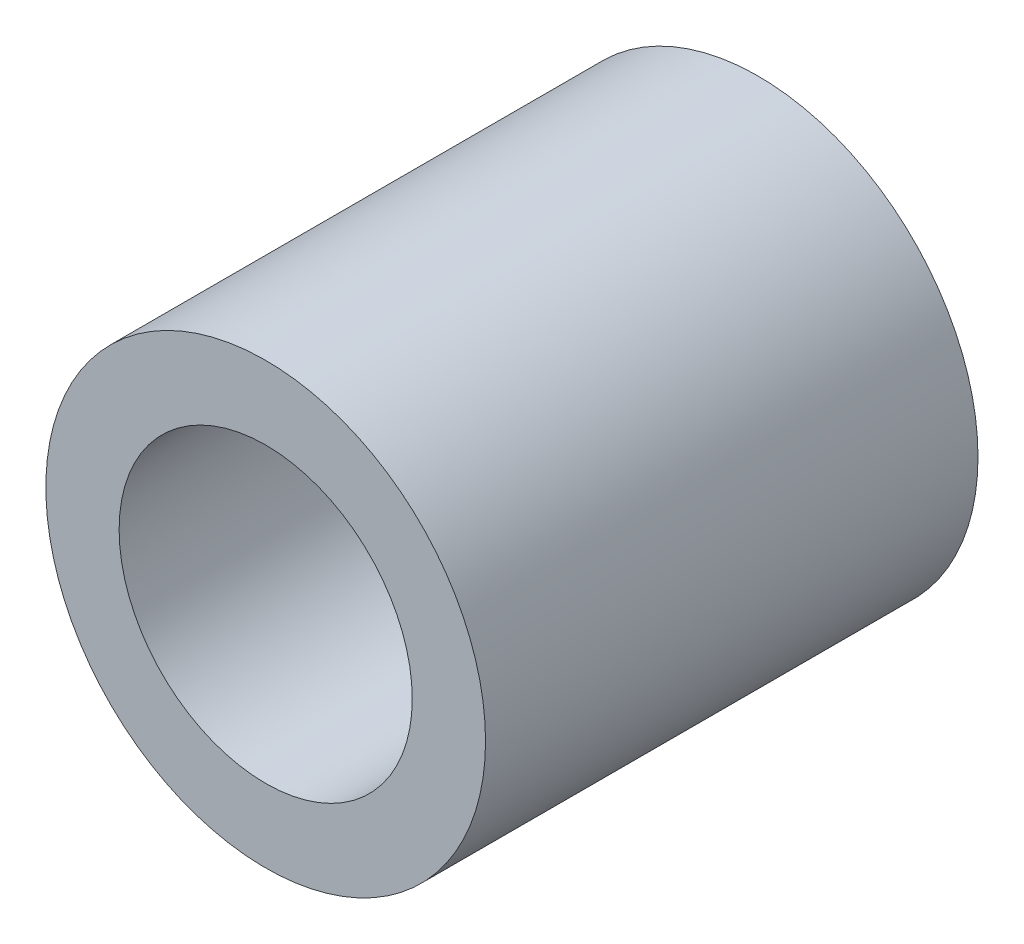
ISO-10303-21;
HEADER;
FILE_DESCRIPTION(('STEP AP214'),'2;1');
FILE_NAME('part.step','',(''),(''),'','','');
FILE_SCHEMA(('AUTOMOTIVE_DESIGN { 1 0 10303 214 1 1 1 1 }'));
ENDSEC;
DATA;
#1=APPLICATION_CONTEXT('core data for automotive mechanical design processes');
#2=APPLICATION_PROTOCOL_DEFINITION('international standard','automotive_design',2000,#1);
#3=PRODUCT_CONTEXT('',#1,'mechanical');
#4=PRODUCT('Part','Part','',(#3));
#5=PRODUCT_RELATED_PRODUCT_CATEGORY('part','',(#4));
#6=PRODUCT_DEFINITION_FORMATION('','',#4);
#7=PRODUCT_DEFINITION_CONTEXT('part definition',#1,'design');
#8=PRODUCT_DEFINITION('design','',#6,#7);
#9=PRODUCT_DEFINITION_SHAPE('','',#8);
#10=(LENGTH_UNIT() NAMED_UNIT(*) SI_UNIT(.MILLI.,.METRE.));
#11=(NAMED_UNIT(*) PLANE_ANGLE_UNIT() SI_UNIT($,.RADIAN.));
#12=(NAMED_UNIT(*) SI_UNIT($,.STERADIAN.) SOLID_ANGLE_UNIT());
#13=UNCERTAINTY_MEASURE_WITH_UNIT(LENGTH_MEASURE(1.E-05),#10,'distance_accuracy_value','');
#14=(GEOMETRIC_REPRESENTATION_CONTEXT(3) GLOBAL_UNCERTAINTY_ASSIGNED_CONTEXT((#13)) GLOBAL_UNIT_ASSIGNED_CONTEXT((#10,
#11,#12)) REPRESENTATION_CONTEXT('',''));
#15=CARTESIAN_POINT('',(0.,0.,0.));
#16=DIRECTION('',(0.,0.,1.));
#17=DIRECTION('',(1.,0.,0.));
#18=AXIS2_PLACEMENT_3D('',#15,#16,#17);
#19=CARTESIAN_POINT('',(0.,0.,10.668));
#20=DIRECTION('',(0.,0.,1.));
#21=DIRECTION('',(1.,0.,0.));
#22=AXIS2_PLACEMENT_3D('',#19,#20,#21);
#23=PLANE('',#22);
#24=CARTESIAN_POINT('',(0.,0.,10.668));
#25=DIRECTION('',(0.,0.,1.));
#26=DIRECTION('',(1.,0.,0.));
#27=AXIS2_PLACEMENT_3D('',#24,#25,#26);
#28=CIRCLE('',#27,9.525);
#29=CARTESIAN_POINT('',(9.525,0.,10.668));
#30=VERTEX_POINT('',#29);
#31=EDGE_CURVE('E10',#30,#30,#28,.T.);
#32=ORIENTED_EDGE('',*,*,#31,.T.);
#33=EDGE_LOOP('',(#32));
#34=FACE_BOUND('',#33,.T.);
#35=CARTESIAN_POINT('',(0.,0.,10.668));
#36=DIRECTION('',(0.,0.,1.));
#37=DIRECTION('',(1.,0.,0.));
#38=AXIS2_PLACEMENT_3D('',#35,#36,#37);
#39=CIRCLE('',#38,6.35);
#40=CARTESIAN_POINT('',(6.35,0.,10.668));
#41=VERTEX_POINT('',#40);
#42=EDGE_CURVE('E56',#41,#41,#39,.T.);
#43=ORIENTED_EDGE('',*,*,#42,.F.);
#44=EDGE_LOOP('',(#43));
#45=FACE_BOUND('',#44,.T.);
#46=ADVANCED_FACE('F43',(#34,#45),#23,.T.);
#47=CARTESIAN_POINT('',(0.,0.,-10.668));
#48=DIRECTION('',(0.,0.,1.));
#49=DIRECTION('',(1.,0.,0.));
#50=AXIS2_PLACEMENT_3D('',#47,#48,#49);
#51=PLANE('',#50);
#52=CARTESIAN_POINT('',(0.,0.,-10.668));
#53=DIRECTION('',(0.,0.,1.));
#54=DIRECTION('',(1.,0.,0.));
#55=AXIS2_PLACEMENT_3D('',#52,#53,#54);
#56=CIRCLE('',#55,9.525);
#57=CARTESIAN_POINT('',(9.525,0.,-10.668));
#58=VERTEX_POINT('',#57);
#59=EDGE_CURVE('E47',#58,#58,#56,.T.);
#60=ORIENTED_EDGE('',*,*,#59,.F.);
#61=EDGE_LOOP('',(#60));
#62=FACE_BOUND('',#61,.T.);
#63=CARTESIAN_POINT('',(0.,0.,-10.668));
#64=DIRECTION('',(0.,0.,1.));
#65=DIRECTION('',(1.,0.,0.));
#66=AXIS2_PLACEMENT_3D('',#63,#64,#65);
#67=CIRCLE('',#66,6.35);
#68=CARTESIAN_POINT('',(6.35,0.,-10.668));
#69=VERTEX_POINT('',#68);
#70=EDGE_CURVE('E58',#69,#69,#67,.T.);
#71=ORIENTED_EDGE('',*,*,#70,.T.);
#72=EDGE_LOOP('',(#71));
#73=FACE_BOUND('',#72,.T.);
#74=ADVANCED_FACE('F70',(#62,#73),#51,.F.);
#75=CARTESIAN_POINT('',(0.,0.,10.668));
#76=DIRECTION('',(0.,0.,-1.));
#77=DIRECTION('',(-1.,0.,0.));
#78=AXIS2_PLACEMENT_3D('',#75,#76,#77);
#79=CYLINDRICAL_SURFACE('',#78,9.525);
#80=ORIENTED_EDGE('',*,*,#31,.F.);
#81=EDGE_LOOP('',(#80));
#82=FACE_BOUND('',#81,.T.);
#83=ORIENTED_EDGE('',*,*,#59,.T.);
#84=EDGE_LOOP('',(#83));
#85=FACE_BOUND('',#84,.T.);
#86=ADVANCED_FACE('F45',(#82,#85),#79,.T.);
#87=CARTESIAN_POINT('',(0.,0.,10.668));
#88=DIRECTION('',(0.,0.,-1.));
#89=DIRECTION('',(-1.,0.,0.));
#90=AXIS2_PLACEMENT_3D('',#87,#88,#89);
#91=CYLINDRICAL_SURFACE('',#90,6.35);
#92=ORIENTED_EDGE('',*,*,#42,.T.);
#93=EDGE_LOOP('',(#92));
#94=FACE_BOUND('',#93,.T.);
#95=ORIENTED_EDGE('',*,*,#70,.F.);
#96=EDGE_LOOP('',(#95));
#97=FACE_BOUND('',#96,.T.);
#98=ADVANCED_FACE('F66',(#94,#97),#91,.F.);
#99=CLOSED_SHELL('',(#46,#74,#86,#98));
#100=MANIFOLD_SOLID_BREP('B2',#99);
#101=ADVANCED_BREP_SHAPE_REPRESENTATION('',(#18,#100),#14);
#102=SHAPE_DEFINITION_REPRESENTATION(#9,#101);
ENDSEC;
END-ISO-10303-21;
